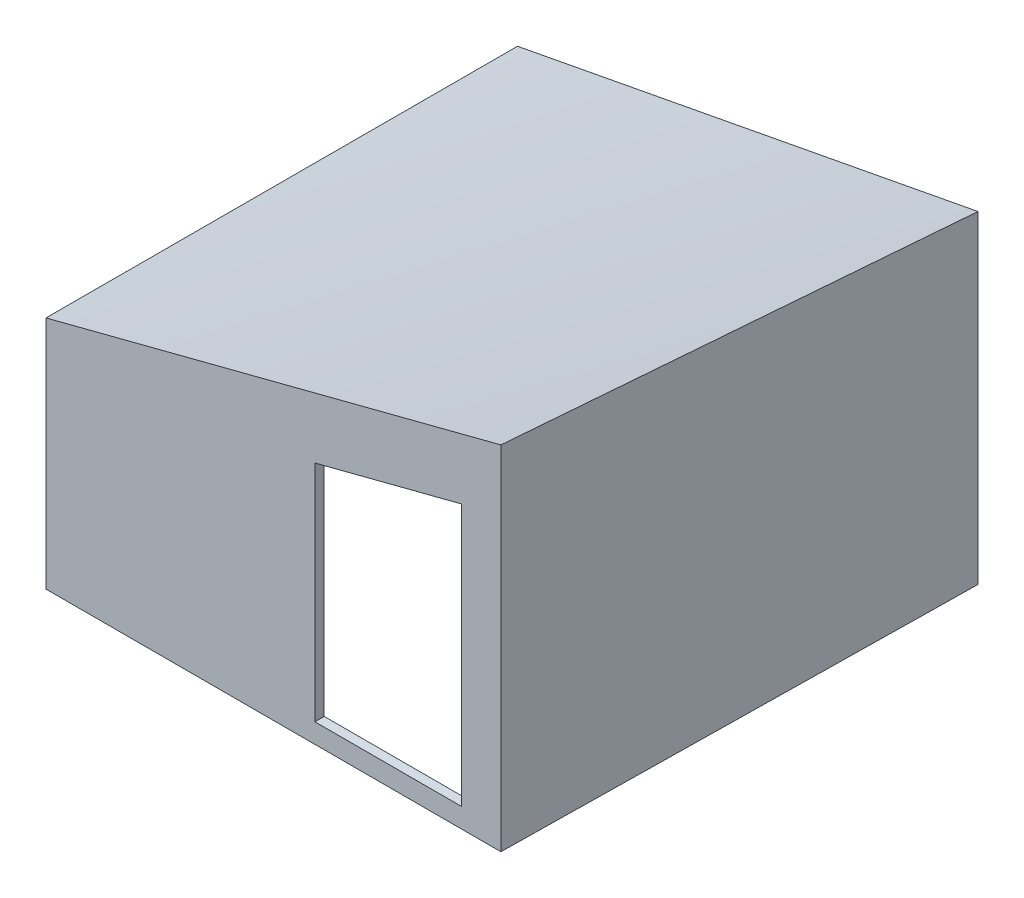
ISO-10303-21;
HEADER;
FILE_DESCRIPTION(('STEP AP214'),'2;1');
FILE_NAME('part.step','',(''),(''),'','','');
FILE_SCHEMA(('AUTOMOTIVE_DESIGN { 1 0 10303 214 1 1 1 1 }'));
ENDSEC;
DATA;
#1=APPLICATION_CONTEXT('core data for automotive mechanical design processes');
#2=APPLICATION_PROTOCOL_DEFINITION('international standard','automotive_design',2000,#1);
#3=PRODUCT_CONTEXT('',#1,'mechanical');
#4=PRODUCT('Part','Part','',(#3));
#5=PRODUCT_RELATED_PRODUCT_CATEGORY('part','',(#4));
#6=PRODUCT_DEFINITION_FORMATION('','',#4);
#7=PRODUCT_DEFINITION_CONTEXT('part definition',#1,'design');
#8=PRODUCT_DEFINITION('design','',#6,#7);
#9=PRODUCT_DEFINITION_SHAPE('','',#8);
#10=(LENGTH_UNIT() NAMED_UNIT(*) SI_UNIT(.MILLI.,.METRE.));
#11=(NAMED_UNIT(*) PLANE_ANGLE_UNIT() SI_UNIT($,.RADIAN.));
#12=(NAMED_UNIT(*) SI_UNIT($,.STERADIAN.) SOLID_ANGLE_UNIT());
#13=UNCERTAINTY_MEASURE_WITH_UNIT(LENGTH_MEASURE(1.E-05),#10,'distance_accuracy_value','');
#14=(GEOMETRIC_REPRESENTATION_CONTEXT(3) GLOBAL_UNCERTAINTY_ASSIGNED_CONTEXT((#13)) GLOBAL_UNIT_ASSIGNED_CONTEXT((#10,
#11,#12)) REPRESENTATION_CONTEXT('',''));
#15=CARTESIAN_POINT('',(0.,0.,0.));
#16=DIRECTION('',(0.,0.,1.));
#17=DIRECTION('',(1.,0.,0.));
#18=AXIS2_PLACEMENT_3D('',#15,#16,#17);
#19=CARTESIAN_POINT('',(0.,0.,0.));
#20=DIRECTION('',(0.,-1.,0.));
#21=DIRECTION('',(0.,0.,-1.));
#22=AXIS2_PLACEMENT_3D('',#19,#20,#21);
#23=PLANE('',#22);
#24=DIRECTION('',(1.,0.,0.));
#25=VECTOR('',#24,1.);
#26=CARTESIAN_POINT('',(0.,0.,0.));
#27=LINE('',#26,#25);
#28=CARTESIAN_POINT('',(-2360.97064784804,0.,-2.56694781585239E-13));
#29=VERTEX_POINT('',#28);
#30=CARTESIAN_POINT('',(0.,0.,0.));
#31=VERTEX_POINT('',#30);
#32=EDGE_CURVE('E281',#29,#31,#27,.T.);
#33=ORIENTED_EDGE('',*,*,#32,.F.);
#34=DIRECTION('',(-0.00105766101411915,0.,0.999999440676433));
#35=VECTOR('',#34,1.);
#36=CARTESIAN_POINT('',(-2360.97064784804,0.,-2.56694781585239E-13));
#37=LINE('',#36,#35);
#38=CARTESIAN_POINT('',(-2358.38493108377,0.,-2444.74863259371));
#39=VERTEX_POINT('',#38);
#40=EDGE_CURVE('E275',#39,#29,#37,.T.);
#41=ORIENTED_EDGE('',*,*,#40,.F.);
#42=DIRECTION('',(-0.999997794522827,0.,-0.00210022605518379));
#43=VECTOR('',#42,1.);
#44=CARTESIAN_POINT('',(-2358.38493108377,0.,-2444.74863259371));
#45=LINE('',#44,#43);
#46=CARTESIAN_POINT('',(36.763794033199,0.,-2439.71826774082));
#47=VERTEX_POINT('',#46);
#48=EDGE_CURVE('E306',#47,#39,#45,.T.);
#49=ORIENTED_EDGE('',*,*,#48,.F.);
#50=DIRECTION('',(0.0150671580558612,0.,-0.999886483931111));
#51=VECTOR('',#50,1.);
#52=CARTESIAN_POINT('',(36.763794033199,0.,-2439.71826774082));
#53=LINE('',#52,#51);
#54=EDGE_CURVE('E282',#31,#47,#53,.T.);
#55=ORIENTED_EDGE('',*,*,#54,.F.);
#56=EDGE_LOOP('',(#33,#41,#49,#55));
#57=FACE_BOUND('',#56,.T.);
#58=DIRECTION('',(-0.00105766101411915,0.,0.999999440676433));
#59=VECTOR('',#58,1.);
#60=CARTESIAN_POINT('',(-2322.86802806596,0.,-2.45680832837998));
#61=LINE('',#60,#59);
#62=CARTESIAN_POINT('',(-2320.32529131273,0.,-2406.56861454145));
#63=VERTEX_POINT('',#62);
#64=CARTESIAN_POINT('',(-2322.83032963063,0.,-38.1000000000002));
#65=VERTEX_POINT('',#64);
#66=EDGE_CURVE('E325',#63,#65,#61,.T.);
#67=ORIENTED_EDGE('',*,*,#66,.T.);
#68=DIRECTION('',(1.,0.,0.));
#69=VECTOR('',#68,1.);
#70=CARTESIAN_POINT('',(0.,0.,-38.1));
#71=LINE('',#70,#69);
#72=CARTESIAN_POINT('',(-37.5302015590173,0.,-38.1));
#73=VERTEX_POINT('',#72);
#74=EDGE_CURVE('E329',#65,#73,#71,.T.);
#75=ORIENTED_EDGE('',*,*,#74,.T.);
#76=DIRECTION('',(0.0150671580558612,0.,-0.999886483931111));
#77=VECTOR('',#76,1.);
#78=CARTESIAN_POINT('',(-38.0956750377753,0.,-0.574058721928314));
#79=LINE('',#78,#77);
#80=CARTESIAN_POINT('',(-1.91343251972513,0.,-2401.69941481006));
#81=VERTEX_POINT('',#80);
#82=EDGE_CURVE('E316',#73,#81,#79,.T.);
#83=ORIENTED_EDGE('',*,*,#82,.T.);
#84=DIRECTION('',(-0.999997794522827,0.,-0.00210022605518379));
#85=VECTOR('',#84,1.);
#86=CARTESIAN_POINT('',(5.04409212297638,0.,-2401.6848024033));
#87=LINE('',#86,#85);
#88=EDGE_CURVE('E321',#81,#63,#87,.T.);
#89=ORIENTED_EDGE('',*,*,#88,.T.);
#90=EDGE_LOOP('',(#67,#75,#83,#89));
#91=FACE_BOUND('',#90,.T.);
#92=ADVANCED_FACE('F67',(#57,#91),#23,.T.);
#93=CARTESIAN_POINT('',(0.,3398.67301701249,0.));
#94=DIRECTION('',(0.,0.,-1.));
#95=DIRECTION('',(-1.,0.,0.));
#96=AXIS2_PLACEMENT_3D('',#93,#94,#95);
#97=PLANE('',#96);
#98=DIRECTION('',(0.,1.,0.));
#99=VECTOR('',#98,1.);
#100=CARTESIAN_POINT('',(-203.2,101.6,0.));
#101=LINE('',#100,#99);
#102=CARTESIAN_POINT('',(-203.2,101.6,0.));
#103=VERTEX_POINT('',#102);
#104=CARTESIAN_POINT('',(-203.2,1461.53789922364,0.));
#105=VERTEX_POINT('',#104);
#106=EDGE_CURVE('E84',#103,#105,#101,.T.);
#107=ORIENTED_EDGE('',*,*,#106,.F.);
#108=DIRECTION('',(1.,0.,0.));
#109=VECTOR('',#108,1.);
#110=CARTESIAN_POINT('',(-965.2,101.6,0.));
#111=LINE('',#110,#109);
#112=CARTESIAN_POINT('',(-965.2,101.6,0.));
#113=VERTEX_POINT('',#112);
#114=EDGE_CURVE('E170',#113,#103,#111,.T.);
#115=ORIENTED_EDGE('',*,*,#114,.F.);
#116=DIRECTION('',(0.,-1.,0.));
#117=VECTOR('',#116,1.);
#118=CARTESIAN_POINT('',(-965.2,1264.7903452363,0.));
#119=LINE('',#118,#117);
#120=CARTESIAN_POINT('',(-965.2,1264.7903452363,0.));
#121=VERTEX_POINT('',#120);
#122=EDGE_CURVE('E184',#121,#113,#119,.T.);
#123=ORIENTED_EDGE('',*,*,#122,.F.);
#124=DIRECTION('',(-0.968245836551854,-0.250000000000001,0.));
#125=VECTOR('',#124,1.);
#126=CARTESIAN_POINT('',(-203.2,1461.53789922364,0.));
#127=LINE('',#126,#125);
#128=EDGE_CURVE('E182',#105,#121,#127,.T.);
#129=ORIENTED_EDGE('',*,*,#128,.F.);
#130=EDGE_LOOP('',(#107,#115,#123,#129));
#131=FACE_BOUND('',#130,.T.);
#132=CARTESIAN_POINT('',(0.,1828.8,-1.57596266416604E-13));
#133=CARTESIAN_POINT('',(-786.990215949348,1625.6,-1.05064177611069E-13));
#134=CARTESIAN_POINT('',(-1573.9804318987,1422.4,0.));
#135=CARTESIAN_POINT('',(-2360.97064784804,1219.2,0.));
#136=B_SPLINE_CURVE_WITH_KNOTS('',3,(#132,#133,#134,#135),.UNSPECIFIED.,.F.,.F.,(4,4),(0.,1.),.UNSPECIFIED.);
#137=CARTESIAN_POINT('',(-2360.97064784804,1219.2,0.));
#138=VERTEX_POINT('',#137);
#139=CARTESIAN_POINT('',(0.,1828.8,2.22044604925031E-13));
#140=VERTEX_POINT('',#139);
#141=EDGE_CURVE('E14',#138,#140,#136,.F.);
#142=ORIENTED_EDGE('',*,*,#141,.F.);
#143=DIRECTION('',(0.,-1.,0.));
#144=VECTOR('',#143,1.);
#145=CARTESIAN_POINT('',(-2360.97064784804,3398.67301701249,-2.56694781585239E-13));
#146=LINE('',#145,#144);
#147=EDGE_CURVE('E71',#138,#29,#146,.T.);
#148=ORIENTED_EDGE('',*,*,#147,.T.);
#149=ORIENTED_EDGE('',*,*,#32,.T.);
#150=DIRECTION('',(0.,-1.,0.));
#151=VECTOR('',#150,1.);
#152=CARTESIAN_POINT('',(0.,3398.67301701249,0.));
#153=LINE('',#152,#151);
#154=EDGE_CURVE('E270',#140,#31,#153,.T.);
#155=ORIENTED_EDGE('',*,*,#154,.F.);
#156=EDGE_LOOP('',(#142,#148,#149,#155));
#157=FACE_BOUND('',#156,.T.);
#158=ADVANCED_FACE('F69',(#131,#157),#97,.F.);
#159=CARTESIAN_POINT('',(36.763794033199,3398.67301701249,-2439.71826774082));
#160=DIRECTION('',(-0.999886483931111,0.,-0.0150671580558612));
#161=DIRECTION('',(-0.0150671580558613,0.,0.999886483931111));
#162=AXIS2_PLACEMENT_3D('',#159,#160,#161);
#163=PLANE('',#162);
#164=CARTESIAN_POINT('',(0.,1828.8,-1.57596266416604E-13));
#165=CARTESIAN_POINT('',(12.2545980110659,1778.,-813.239422580273));
#166=CARTESIAN_POINT('',(24.5091960221318,1727.2,-1626.47884516055));
#167=CARTESIAN_POINT('',(36.7637940331977,1676.4,-2439.71826774082));
#168=B_SPLINE_CURVE_WITH_KNOTS('',3,(#164,#165,#166,#167),.UNSPECIFIED.,.F.,.F.,(4,4),(0.,1.),.UNSPECIFIED.);
#169=CARTESIAN_POINT('',(36.7637940331989,1676.4,-2439.71826774082));
#170=VERTEX_POINT('',#169);
#171=EDGE_CURVE('E267',#140,#170,#168,.T.);
#172=ORIENTED_EDGE('',*,*,#171,.F.);
#173=ORIENTED_EDGE('',*,*,#154,.T.);
#174=ORIENTED_EDGE('',*,*,#54,.T.);
#175=DIRECTION('',(0.,-1.,0.));
#176=VECTOR('',#175,1.);
#177=CARTESIAN_POINT('',(36.763794033199,3398.67301701249,-2439.71826774082));
#178=LINE('',#177,#176);
#179=EDGE_CURVE('E272',#170,#47,#178,.T.);
#180=ORIENTED_EDGE('',*,*,#179,.F.);
#181=EDGE_LOOP('',(#172,#173,#174,#180));
#182=FACE_BOUND('',#181,.T.);
#183=ADVANCED_FACE('F248',(#182),#163,.F.);
#184=CARTESIAN_POINT('',(-2358.38493108377,3398.67301701249,-2444.74863259371));
#185=DIRECTION('',(-0.00210022605518379,0.,0.999997794522827));
#186=DIRECTION('',(0.999997794522827,0.,0.00210022605518379));
#187=AXIS2_PLACEMENT_3D('',#184,#185,#186);
#188=PLANE('',#187);
#189=CARTESIAN_POINT('',(36.7637940331977,1676.4,-2439.71826774082));
#190=CARTESIAN_POINT('',(-761.619114339126,1524.,-2441.39505602511));
#191=CARTESIAN_POINT('',(-1560.00202271145,1371.6,-2443.07184430941));
#192=CARTESIAN_POINT('',(-2358.38493108377,1219.2,-2444.74863259371));
#193=B_SPLINE_CURVE_WITH_KNOTS('',3,(#189,#190,#191,#192),.UNSPECIFIED.,.F.,.F.,(4,4),(0.,1.),.UNSPECIFIED.);
#194=CARTESIAN_POINT('',(-2358.38493108377,1219.2,-2444.74863259371));
#195=VERTEX_POINT('',#194);
#196=EDGE_CURVE('E274',#170,#195,#193,.T.);
#197=ORIENTED_EDGE('',*,*,#196,.F.);
#198=ORIENTED_EDGE('',*,*,#179,.T.);
#199=ORIENTED_EDGE('',*,*,#48,.T.);
#200=DIRECTION('',(0.,-1.,0.));
#201=VECTOR('',#200,1.);
#202=CARTESIAN_POINT('',(-2358.38493108377,3398.67301701249,-2444.74863259371));
#203=LINE('',#202,#201);
#204=EDGE_CURVE('E307',#195,#39,#203,.T.);
#205=ORIENTED_EDGE('',*,*,#204,.F.);
#206=EDGE_LOOP('',(#197,#198,#199,#205));
#207=FACE_BOUND('',#206,.T.);
#208=ADVANCED_FACE('F257',(#207),#188,.F.);
#209=CARTESIAN_POINT('',(-2360.97064784804,3398.67301701249,-2.56694781585239E-13));
#210=DIRECTION('',(0.999999440676433,0.,0.00105766101411915));
#211=DIRECTION('',(0.00105766101411915,0.,-0.999999440676433));
#212=AXIS2_PLACEMENT_3D('',#209,#210,#211);
#213=PLANE('',#212);
#214=CARTESIAN_POINT('',(-2360.97064784804,1219.2,0.));
#215=CARTESIAN_POINT('',(-2360.10874225995,1219.2,-814.916210864569));
#216=CARTESIAN_POINT('',(-2359.24683667186,1219.2,-1629.83242172914));
#217=CARTESIAN_POINT('',(-2358.38493108377,1219.2,-2444.74863259371));
#218=B_SPLINE_CURVE_WITH_KNOTS('',3,(#214,#215,#216,#217),.UNSPECIFIED.,.F.,.F.,(4,4),(0.,1.),.UNSPECIFIED.);
#219=EDGE_CURVE('E76',#195,#138,#218,.F.);
#220=ORIENTED_EDGE('',*,*,#219,.F.);
#221=ORIENTED_EDGE('',*,*,#204,.T.);
#222=ORIENTED_EDGE('',*,*,#40,.T.);
#223=ORIENTED_EDGE('',*,*,#147,.F.);
#224=EDGE_LOOP('',(#220,#221,#222,#223));
#225=FACE_BOUND('',#224,.T.);
#226=ADVANCED_FACE('F222',(#225),#213,.F.);
#227=CARTESIAN_POINT('',(0.,1828.8,-1.57596266416604E-13));
#228=CARTESIAN_POINT('',(-786.990215949348,1625.6,-1.05064177611069E-13));
#229=CARTESIAN_POINT('',(-1573.9804318987,1422.4,0.));
#230=CARTESIAN_POINT('',(-2360.97064784804,1219.2,0.));
#231=CARTESIAN_POINT('',(12.2545980110659,1778.,-813.239422580273));
#232=CARTESIAN_POINT('',(-778.533182079274,1591.73333333333,-813.798352008372));
#233=CARTESIAN_POINT('',(-1569.32096216961,1405.46666666667,-814.35728143647));
#234=CARTESIAN_POINT('',(-2360.10874225995,1219.2,-814.916210864569));
#235=CARTESIAN_POINT('',(24.5091960221318,1727.2,-1626.47884516055));
#236=CARTESIAN_POINT('',(-770.0761482092,1557.86666666667,-1627.59670401674));
#237=CARTESIAN_POINT('',(-1564.66149244053,1388.53333333333,-1628.71456287294));
#238=CARTESIAN_POINT('',(-2359.24683667186,1219.2,-1629.83242172914));
#239=CARTESIAN_POINT('',(36.7637940331977,1676.4,-2439.71826774082));
#240=CARTESIAN_POINT('',(-761.619114339126,1524.,-2441.39505602511));
#241=CARTESIAN_POINT('',(-1560.00202271145,1371.6,-2443.07184430941));
#242=CARTESIAN_POINT('',(-2358.38493108377,1219.2,-2444.74863259371));
#243=B_SPLINE_SURFACE_WITH_KNOTS('',3,3,((#227,#228,#229,#230),(#231,#232,#233,#234),(#235,#236,
#237,#238),(#239,#240,#241,#242)),.UNSPECIFIED.,.F.,.F.,.F.,(4,4),(4,4),(0.,1.),(0.,1.),.UNSPECIFIED.);
#244=ORIENTED_EDGE('',*,*,#171,.T.);
#245=ORIENTED_EDGE('',*,*,#196,.T.);
#246=ORIENTED_EDGE('',*,*,#219,.T.);
#247=ORIENTED_EDGE('',*,*,#141,.T.);
#248=EDGE_LOOP('',(#244,#245,#246,#247));
#249=FACE_BOUND('',#248,.T.);
#250=ADVANCED_FACE('F216',(#249),#243,.T.);
#251=CARTESIAN_POINT('',(0.,3398.67301701249,-38.1));
#252=DIRECTION('',(0.,0.,-1.));
#253=DIRECTION('',(-1.,0.,0.));
#254=AXIS2_PLACEMENT_3D('',#251,#252,#253);
#255=PLANE('',#254);
#256=DIRECTION('',(1.,0.,0.));
#257=VECTOR('',#256,1.);
#258=CARTESIAN_POINT('',(-965.2,111.808864231626,-38.1000000000001));
#259=LINE('',#258,#257);
#260=CARTESIAN_POINT('',(-954.991135768374,111.808864231626,-38.1000000000001));
#261=VERTEX_POINT('',#260);
#262=CARTESIAN_POINT('',(-213.408864231626,111.808864231626,-38.1));
#263=VERTEX_POINT('',#262);
#264=EDGE_CURVE('E175',#261,#263,#259,.T.);
#265=ORIENTED_EDGE('',*,*,#264,.T.);
#266=DIRECTION('',(0.,1.,0.));
#267=VECTOR('',#266,1.);
#268=CARTESIAN_POINT('',(-213.408864231626,101.6,-38.1));
#269=LINE('',#268,#267);
#270=CARTESIAN_POINT('',(-213.408864231626,1448.35831217271,-38.1));
#271=VERTEX_POINT('',#270);
#272=EDGE_CURVE('E168',#263,#271,#269,.T.);
#273=ORIENTED_EDGE('',*,*,#272,.T.);
#274=DIRECTION('',(-0.968245836551854,-0.250000000000001,0.));
#275=VECTOR('',#274,1.);
#276=CARTESIAN_POINT('',(-200.647783942094,1451.65320893545,-38.1));
#277=LINE('',#276,#275);
#278=CARTESIAN_POINT('',(-954.991135768374,1256.88259300575,-38.1000000000001));
#279=VERTEX_POINT('',#278);
#280=EDGE_CURVE('E157',#271,#279,#277,.T.);
#281=ORIENTED_EDGE('',*,*,#280,.T.);
#282=DIRECTION('',(0.,-1.,0.));
#283=VECTOR('',#282,1.);
#284=CARTESIAN_POINT('',(-954.991135768374,1264.7903452363,-38.1000000000001));
#285=LINE('',#284,#283);
#286=EDGE_CURVE('E176',#279,#261,#285,.T.);
#287=ORIENTED_EDGE('',*,*,#286,.T.);
#288=EDGE_LOOP('',(#265,#273,#281,#287));
#289=FACE_BOUND('',#288,.T.);
#290=CARTESIAN_POINT('',(-2322.83032963062,1189.65742736906,-38.1000000000003));
#291=CARTESIAN_POINT('',(-2125.83539017102,1240.31147440051,-38.1000000000002));
#292=CARTESIAN_POINT('',(-1928.84002043219,1290.96384805859,-38.1000000000002));
#293=CARTESIAN_POINT('',(-1534.84841896842,1392.26524285151,-38.1000000000002));
#294=CARTESIAN_POINT('',(-1337.85218724347,1442.91426398634,-38.1000000000002));
#295=CARTESIAN_POINT('',(-773.08192258129,1588.11526505387,-38.1000000000001));
#296=CARTESIAN_POINT('',(-405.306816711938,1682.66307175222,-38.1000000000001));
#297=CARTESIAN_POINT('',(-37.5302015590175,1777.20500727296,-38.1));
#298=B_SPLINE_CURVE_WITH_KNOTS('',3,(#290,#291,#292,#293,#294,#295,#296,#297),.UNSPECIFIED.,.F.,
.F.,(4,2,2,4),(0.,610.209429513796,1220.4188590277,2359.62048553019),.UNSPECIFIED.);
#299=CARTESIAN_POINT('',(-2322.83032963062,1189.65742736906,-38.1000000000003));
#300=VERTEX_POINT('',#299);
#301=CARTESIAN_POINT('',(-37.5302015590173,1777.20500727296,-38.1));
#302=VERTEX_POINT('',#301);
#303=EDGE_CURVE('E193',#300,#302,#298,.T.);
#304=ORIENTED_EDGE('',*,*,#303,.T.);
#305=DIRECTION('',(0.,-1.,0.));
#306=VECTOR('',#305,1.);
#307=CARTESIAN_POINT('',(-37.5302015590173,3398.67301701249,-38.1));
#308=LINE('',#307,#306);
#309=EDGE_CURVE('E320',#302,#73,#308,.T.);
#310=ORIENTED_EDGE('',*,*,#309,.T.);
#311=ORIENTED_EDGE('',*,*,#74,.F.);
#312=DIRECTION('',(0.,-1.,0.));
#313=VECTOR('',#312,1.);
#314=CARTESIAN_POINT('',(-2322.83032963063,3398.67301701249,-38.1000000000002));
#315=LINE('',#314,#313);
#316=EDGE_CURVE('E164',#300,#65,#315,.T.);
#317=ORIENTED_EDGE('',*,*,#316,.F.);
#318=EDGE_LOOP('',(#304,#310,#311,#317));
#319=FACE_BOUND('',#318,.T.);
#320=ADVANCED_FACE('F173',(#289,#319),#255,.T.);
#321=CARTESIAN_POINT('',(-1.33188100457628,3398.67301701249,-2440.29232646275));
#322=DIRECTION('',(-0.999886483931111,0.,-0.0150671580558612));
#323=DIRECTION('',(-0.0150671580558613,0.,0.999886483931111));
#324=AXIS2_PLACEMENT_3D('',#321,#322,#323);
#325=PLANE('',#324);
#326=CARTESIAN_POINT('',(-37.5302015590173,1777.20500727296,-38.1));
#327=CARTESIAN_POINT('',(-34.5621284050158,1765.16407786347,-235.067219631068));
#328=CARTESIAN_POINT('',(-31.5940575482263,1753.12065415075,-432.034286814596));
#329=CARTESIAN_POINT('',(-25.6579203866668,1729.02886815056,-825.968119100611));
#330=CARTESIAN_POINT('',(-22.6898540818968,1716.98050586309,-1022.9348842031));
#331=CARTESIAN_POINT('',(-16.7537259709673,1692.87889270043,-1416.86811587136));
#332=CARTESIAN_POINT('',(-13.7856641648078,1680.82564182523,-1613.83458243714));
#333=CARTESIAN_POINT('',(-7.84954501016596,1656.71430385332,-2007.7672197484));
#334=CARTESIAN_POINT('',(-4.88148766168361,1644.6562167566,-2204.73339049388));
#335=CARTESIAN_POINT('',(-1.9134325197255,1632.59573772476,-2401.69941481006));
#336=B_SPLINE_CURVE_WITH_KNOTS('',3,(#326,#327,#328,#329,#330,#331,#332,#333,#334,#335),
.UNSPECIFIED.,.F.,.F.,(4,2,2,2,4),(0.,592.071711379134,1184.14342239375,1776.21513487455,
2368.28684771985),.UNSPECIFIED.);
#337=CARTESIAN_POINT('',(-1.91343251972513,1632.59573772476,-2401.69941481006));
#338=VERTEX_POINT('',#337);
#339=EDGE_CURVE('E328',#302,#338,#336,.T.);
#340=ORIENTED_EDGE('',*,*,#339,.T.);
#341=DIRECTION('',(0.,-1.,0.));
#342=VECTOR('',#341,1.);
#343=CARTESIAN_POINT('',(-1.91343251972498,3398.67301701249,-2401.69941481006));
#344=LINE('',#343,#342);
#345=EDGE_CURVE('E319',#338,#81,#344,.T.);
#346=ORIENTED_EDGE('',*,*,#345,.T.);
#347=ORIENTED_EDGE('',*,*,#82,.F.);
#348=ORIENTED_EDGE('',*,*,#309,.F.);
#349=EDGE_LOOP('',(#340,#346,#347,#348));
#350=FACE_BOUND('',#349,.T.);
#351=ADVANCED_FACE('F211',(#350),#325,.T.);
#352=CARTESIAN_POINT('',(-2358.46494969648,3398.67301701249,-2406.64871662239));
#353=DIRECTION('',(-0.00210022605518379,0.,0.999997794522827));
#354=DIRECTION('',(0.999997794522827,0.,0.00210022605518379));
#355=AXIS2_PLACEMENT_3D('',#352,#353,#354);
#356=PLANE('',#355);
#357=CARTESIAN_POINT('',(-1.91343251972513,1632.59573772476,-2401.69941481006));
#358=CARTESIAN_POINT('',(-201.672793639578,1594.27002464588,-2402.11895555034));
#359=CARTESIAN_POINT('',(-401.431866608548,1555.94280968214,-2402.53849568543));
#360=CARTESIAN_POINT('',(-800.949436980742,1479.28538005008,-2403.3775747468));
#361=CARTESIAN_POINT('',(-1000.70793438397,1440.95516538175,-2403.79711367307));
#362=CARTESIAN_POINT('',(-1573.75352954518,1330.99313179346,-2405.00064161719));
#363=CARTESIAN_POINT('',(-1947.03991105815,1259.35758026916,-2405.78462913076));
#364=CARTESIAN_POINT('',(-2320.32529131273,1187.71681158424,-2406.56861454145));
#365=B_SPLINE_CURVE_WITH_KNOTS('',3,(#357,#358,#359,#360,#361,#362,#363,#364),.UNSPECIFIED.,.F.,
.F.,(4,2,2,4),(0.,610.209429508989,1220.41885901796,2360.71483164646),.UNSPECIFIED.);
#366=CARTESIAN_POINT('',(-2320.32529131273,1187.71681158424,-2406.56861454145));
#367=VERTEX_POINT('',#366);
#368=EDGE_CURVE('E337',#338,#367,#365,.T.);
#369=ORIENTED_EDGE('',*,*,#368,.T.);
#370=DIRECTION('',(0.,-1.,0.));
#371=VECTOR('',#370,1.);
#372=CARTESIAN_POINT('',(-2320.32529131273,3398.67301701249,-2406.56861454145));
#373=LINE('',#372,#371);
#374=EDGE_CURVE('E324',#367,#63,#373,.T.);
#375=ORIENTED_EDGE('',*,*,#374,.T.);
#376=ORIENTED_EDGE('',*,*,#88,.F.);
#377=ORIENTED_EDGE('',*,*,#345,.F.);
#378=EDGE_LOOP('',(#369,#375,#376,#377));
#379=FACE_BOUND('',#378,.T.);
#380=ADVANCED_FACE('F345',(#379),#356,.T.);
#381=CARTESIAN_POINT('',(-2322.87066915827,3398.67301701249,0.0402968846376828));
#382=DIRECTION('',(0.999999440676433,0.,0.00105766101411915));
#383=DIRECTION('',(0.00105766101411915,0.,-0.999999440676433));
#384=AXIS2_PLACEMENT_3D('',#381,#382,#383);
#385=PLANE('',#384);
#386=CARTESIAN_POINT('',(-2320.32529131273,1187.71681158424,-2406.56861454145));
#387=CARTESIAN_POINT('',(-2320.53404450237,1187.88251892814,-2209.1962333223));
#388=CARTESIAN_POINT('',(-2320.74279769288,1188.04724365691,-2011.82385127793));
#389=CARTESIAN_POINT('',(-2321.16030407563,1188.37470542618,-1617.07908556081));
#390=CARTESIAN_POINT('',(-2321.36905726787,1188.53744246668,-1419.70670188805));
#391=CARTESIAN_POINT('',(-2321.78656365417,1188.86090640147,-1024.96193281391));
#392=CARTESIAN_POINT('',(-2321.99531684823,1189.02163329576,-827.58954741254));
#393=CARTESIAN_POINT('',(-2322.41282323811,1189.34105744009,-432.84477494701));
#394=CARTESIAN_POINT('',(-2322.62157643394,1189.49975469014,-235.472387882851));
#395=CARTESIAN_POINT('',(-2322.83032963062,1189.65742736906,-38.1000000000003));
#396=B_SPLINE_CURVE_WITH_KNOTS('',3,(#386,#387,#388,#389,#390,#391,#392,#393,#394,#395),
.UNSPECIFIED.,.F.,.F.,(4,2,2,2,4),(0.,592.117683524098,1184.23536698684,1776.35305069354,
2368.47073446159),.UNSPECIFIED.);
#397=EDGE_CURVE('E201',#367,#300,#396,.T.);
#398=ORIENTED_EDGE('',*,*,#397,.T.);
#399=ORIENTED_EDGE('',*,*,#316,.T.);
#400=ORIENTED_EDGE('',*,*,#66,.F.);
#401=ORIENTED_EDGE('',*,*,#374,.F.);
#402=EDGE_LOOP('',(#398,#399,#400,#401));
#403=FACE_BOUND('',#402,.T.);
#404=ADVANCED_FACE('F209',(#403),#385,.T.);
#405=CARTESIAN_POINT('',(0.,1828.8,-1.57596266416604E-13));
#406=CARTESIAN_POINT('',(-786.990215949348,1625.6,-1.05064177611069E-13));
#407=CARTESIAN_POINT('',(-1573.9804318987,1422.4,0.));
#408=CARTESIAN_POINT('',(-2360.97064784804,1219.2,0.));
#409=CARTESIAN_POINT('',(12.2545980110659,1778.,-813.239422580273));
#410=CARTESIAN_POINT('',(-778.533182079274,1591.73333333333,-813.798352008372));
#411=CARTESIAN_POINT('',(-1569.32096216961,1405.46666666667,-814.35728143647));
#412=CARTESIAN_POINT('',(-2360.10874225995,1219.2,-814.916210864569));
#413=CARTESIAN_POINT('',(24.5091960221318,1727.2,-1626.47884516055));
#414=CARTESIAN_POINT('',(-770.0761482092,1557.86666666667,-1627.59670401674));
#415=CARTESIAN_POINT('',(-1564.66149244053,1388.53333333333,-1628.71456287294));
#416=CARTESIAN_POINT('',(-2359.24683667186,1219.2,-1629.83242172914));
#417=CARTESIAN_POINT('',(36.7637940331977,1676.4,-2439.71826774082));
#418=CARTESIAN_POINT('',(-761.619114339126,1524.,-2441.39505602511));
#419=CARTESIAN_POINT('',(-1560.00202271145,1371.6,-2443.07184430941));
#420=CARTESIAN_POINT('',(-2358.38493108377,1219.2,-2444.74863259371));
#421=B_SPLINE_SURFACE_WITH_KNOTS('',3,3,((#405,#406,#407,#408),(#409,#410,#411,#412),(#413,#414,
#415,#416),(#417,#418,#419,#420)),.UNSPECIFIED.,.F.,.F.,.F.,(4,4),(4,4),(0.,1.),(0.,1.),.UNSPECIFIED.);
#422=OFFSET_SURFACE('',#421,-38.1,.F.);
#423=ORIENTED_EDGE('',*,*,#339,.F.);
#424=ORIENTED_EDGE('',*,*,#303,.F.);
#425=ORIENTED_EDGE('',*,*,#397,.F.);
#426=ORIENTED_EDGE('',*,*,#368,.F.);
#427=EDGE_LOOP('',(#423,#424,#425,#426));
#428=FACE_BOUND('',#427,.T.);
#429=ADVANCED_FACE('F205',(#428),#422,.F.);
#430=CARTESIAN_POINT('',(-203.2,101.6,0.));
#431=DIRECTION('',(0.965925826289068,0.,-0.258819045102521));
#432=DIRECTION('',(-0.258819045102521,0.,-0.965925826289068));
#433=AXIS2_PLACEMENT_3D('',#430,#431,#432);
#434=PLANE('',#433);
#435=DIRECTION('',(0.250562807085732,-0.250562807085732,0.935113126531029));
#436=VECTOR('',#435,1.);
#437=CARTESIAN_POINT('',(-251.039670864548,149.439670864548,-178.540082283864));
#438=LINE('',#437,#436);
#439=EDGE_CURVE('E165',#263,#103,#438,.T.);
#440=ORIENTED_EDGE('',*,*,#439,.T.);
#441=ORIENTED_EDGE('',*,*,#106,.T.);
#442=DIRECTION('',(0.245478281360805,0.316911098522006,0.91613741819321));
#443=VECTOR('',#442,1.);
#444=CARTESIAN_POINT('',(-308.996085743743,1324.95573983049,-394.836367237563));
#445=LINE('',#444,#443);
#446=EDGE_CURVE('E159',#271,#105,#445,.T.);
#447=ORIENTED_EDGE('',*,*,#446,.F.);
#448=ORIENTED_EDGE('',*,*,#272,.F.);
#449=EDGE_LOOP('',(#440,#441,#447,#448));
#450=FACE_BOUND('',#449,.T.);
#451=ADVANCED_FACE('F167',(#450),#434,.F.);
#452=CARTESIAN_POINT('',(-965.2,1264.7903452363,0.));
#453=DIRECTION('',(-0.965925826289068,0.,-0.258819045102521));
#454=DIRECTION('',(-0.258819045102521,0.,0.965925826289068));
#455=AXIS2_PLACEMENT_3D('',#452,#453,#454);
#456=PLANE('',#455);
#457=DIRECTION('',(-0.253769484114954,0.196568997150573,0.947080608127549));
#458=VECTOR('',#457,1.);
#459=CARTESIAN_POINT('',(-925.942399428965,1234.38153859157,-146.511359914345));
#460=LINE('',#459,#458);
#461=EDGE_CURVE('E92',#279,#121,#460,.T.);
#462=ORIENTED_EDGE('',*,*,#461,.T.);
#463=ORIENTED_EDGE('',*,*,#122,.T.);
#464=DIRECTION('',(-0.250562807085732,-0.250562807085732,0.935113126531029));
#465=VECTOR('',#464,1.);
#466=CARTESIAN_POINT('',(-892.1729090959,174.6270909041,-272.540813583051));
#467=LINE('',#466,#465);
#468=EDGE_CURVE('E189',#261,#113,#467,.T.);
#469=ORIENTED_EDGE('',*,*,#468,.F.);
#470=ORIENTED_EDGE('',*,*,#286,.F.);
#471=EDGE_LOOP('',(#462,#463,#469,#470));
#472=FACE_BOUND('',#471,.T.);
#473=ADVANCED_FACE('F232',(#472),#456,.F.);
#474=CARTESIAN_POINT('',(-965.2,101.6,0.));
#475=DIRECTION('',(0.,-0.965925826289068,-0.258819045102521));
#476=DIRECTION('',(0.,0.258819045102521,-0.965925826289068));
#477=AXIS2_PLACEMENT_3D('',#474,#475,#476);
#478=PLANE('',#477);
#479=ORIENTED_EDGE('',*,*,#468,.T.);
#480=ORIENTED_EDGE('',*,*,#114,.T.);
#481=ORIENTED_EDGE('',*,*,#439,.F.);
#482=ORIENTED_EDGE('',*,*,#264,.F.);
#483=EDGE_LOOP('',(#479,#480,#481,#482));
#484=FACE_BOUND('',#483,.T.);
#485=ADVANCED_FACE('F224',(#484),#478,.F.);
#486=CARTESIAN_POINT('',(-203.2,1461.53789922364,0.));
#487=DIRECTION('',(-0.241481456572268,0.9352536597223,-0.258819045102521));
#488=DIRECTION('',(0.,0.266712279282941,0.963776198128849));
#489=AXIS2_PLACEMENT_3D('',#486,#487,#488);
#490=PLANE('',#489);
#491=ORIENTED_EDGE('',*,*,#446,.T.);
#492=ORIENTED_EDGE('',*,*,#128,.T.);
#493=ORIENTED_EDGE('',*,*,#461,.F.);
#494=ORIENTED_EDGE('',*,*,#280,.F.);
#495=EDGE_LOOP('',(#491,#492,#493,#494));
#496=FACE_BOUND('',#495,.T.);
#497=ADVANCED_FACE('F158',(#496),#490,.F.);
#498=CLOSED_SHELL('',(#92,#158,#183,#208,#226,#250,#320,#351,#380,#404,#429,#451,#473,#485,#497));
#499=MANIFOLD_SOLID_BREP('B2',#498);
#500=ADVANCED_BREP_SHAPE_REPRESENTATION('',(#18,#499),#14);
#501=SHAPE_DEFINITION_REPRESENTATION(#9,#500);
ENDSEC;
END-ISO-10303-21;
